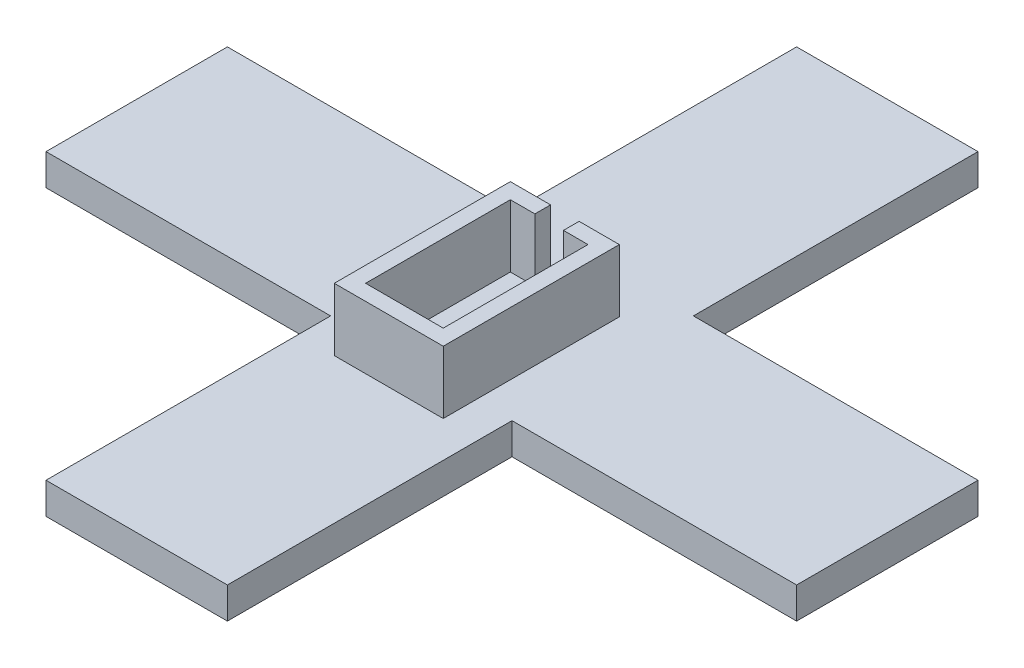
ISO-10303-21;
HEADER;
FILE_DESCRIPTION(('STEP AP214'),'2;1');
FILE_NAME('part.step','',(''),(''),'','','');
FILE_SCHEMA(('AUTOMOTIVE_DESIGN { 1 0 10303 214 1 1 1 1 }'));
ENDSEC;
DATA;
#1=APPLICATION_CONTEXT('core data for automotive mechanical design processes');
#2=APPLICATION_PROTOCOL_DEFINITION('international standard','automotive_design',2000,#1);
#3=PRODUCT_CONTEXT('',#1,'mechanical');
#4=PRODUCT('Part','Part','',(#3));
#5=PRODUCT_RELATED_PRODUCT_CATEGORY('part','',(#4));
#6=PRODUCT_DEFINITION_FORMATION('','',#4);
#7=PRODUCT_DEFINITION_CONTEXT('part definition',#1,'design');
#8=PRODUCT_DEFINITION('design','',#6,#7);
#9=PRODUCT_DEFINITION_SHAPE('','',#8);
#10=(LENGTH_UNIT() NAMED_UNIT(*) SI_UNIT(.MILLI.,.METRE.));
#11=(NAMED_UNIT(*) PLANE_ANGLE_UNIT() SI_UNIT($,.RADIAN.));
#12=(NAMED_UNIT(*) SI_UNIT($,.STERADIAN.) SOLID_ANGLE_UNIT());
#13=UNCERTAINTY_MEASURE_WITH_UNIT(LENGTH_MEASURE(1.E-05),#10,'distance_accuracy_value','');
#14=(GEOMETRIC_REPRESENTATION_CONTEXT(3) GLOBAL_UNCERTAINTY_ASSIGNED_CONTEXT((#13)) GLOBAL_UNIT_ASSIGNED_CONTEXT((#10,
#11,#12)) REPRESENTATION_CONTEXT('',''));
#15=CARTESIAN_POINT('',(0.,0.,0.));
#16=DIRECTION('',(0.,0.,1.));
#17=DIRECTION('',(1.,0.,0.));
#18=AXIS2_PLACEMENT_3D('',#15,#16,#17);
#19=CARTESIAN_POINT('',(0.,5.,0.));
#20=DIRECTION('',(0.,1.,0.));
#21=DIRECTION('',(0.,0.,1.));
#22=AXIS2_PLACEMENT_3D('',#19,#20,#21);
#23=PLANE('',#22);
#24=DIRECTION('',(-1.,0.,0.));
#25=VECTOR('',#24,1.);
#26=CARTESIAN_POINT('',(14.48,5.,-59.92));
#27=LINE('',#26,#25);
#28=CARTESIAN_POINT('',(14.48,5.,-59.92));
#29=VERTEX_POINT('',#28);
#30=CARTESIAN_POINT('',(-14.48,5.,-59.92));
#31=VERTEX_POINT('',#30);
#32=EDGE_CURVE('E115',#29,#31,#27,.T.);
#33=ORIENTED_EDGE('',*,*,#32,.T.);
#34=DIRECTION('',(0.,0.,1.));
#35=VECTOR('',#34,1.);
#36=CARTESIAN_POINT('',(-14.48,5.,-59.92));
#37=LINE('',#36,#35);
#38=CARTESIAN_POINT('',(-14.48,5.,-14.48));
#39=VERTEX_POINT('',#38);
#40=EDGE_CURVE('E298',#31,#39,#37,.T.);
#41=ORIENTED_EDGE('',*,*,#40,.T.);
#42=DIRECTION('',(-1.,0.,0.));
#43=VECTOR('',#42,1.);
#44=CARTESIAN_POINT('',(-14.48,5.,-14.48));
#45=LINE('',#44,#43);
#46=CARTESIAN_POINT('',(-59.92,5.,-14.48));
#47=VERTEX_POINT('',#46);
#48=EDGE_CURVE('E252',#39,#47,#45,.T.);
#49=ORIENTED_EDGE('',*,*,#48,.T.);
#50=DIRECTION('',(0.,0.,1.));
#51=VECTOR('',#50,1.);
#52=CARTESIAN_POINT('',(-59.92,5.,0.));
#53=LINE('',#52,#51);
#54=CARTESIAN_POINT('',(-59.92,5.,14.48));
#55=VERTEX_POINT('',#54);
#56=EDGE_CURVE('E270',#47,#55,#53,.T.);
#57=ORIENTED_EDGE('',*,*,#56,.T.);
#58=DIRECTION('',(1.,0.,0.));
#59=VECTOR('',#58,1.);
#60=CARTESIAN_POINT('',(-59.92,5.,14.48));
#61=LINE('',#60,#59);
#62=CARTESIAN_POINT('',(-14.48,5.,14.48));
#63=VERTEX_POINT('',#62);
#64=EDGE_CURVE('E266',#55,#63,#61,.T.);
#65=ORIENTED_EDGE('',*,*,#64,.T.);
#66=DIRECTION('',(0.,0.,1.));
#67=VECTOR('',#66,1.);
#68=CARTESIAN_POINT('',(-14.48,5.,14.48));
#69=LINE('',#68,#67);
#70=CARTESIAN_POINT('',(-14.48,5.,59.92));
#71=VERTEX_POINT('',#70);
#72=EDGE_CURVE('E269',#63,#71,#69,.T.);
#73=ORIENTED_EDGE('',*,*,#72,.T.);
#74=DIRECTION('',(1.,0.,0.));
#75=VECTOR('',#74,1.);
#76=CARTESIAN_POINT('',(-14.48,5.,59.92));
#77=LINE('',#76,#75);
#78=CARTESIAN_POINT('',(14.48,5.,59.92));
#79=VERTEX_POINT('',#78);
#80=EDGE_CURVE('E274',#71,#79,#77,.T.);
#81=ORIENTED_EDGE('',*,*,#80,.T.);
#82=DIRECTION('',(0.,0.,-1.));
#83=VECTOR('',#82,1.);
#84=CARTESIAN_POINT('',(14.48,5.,59.92));
#85=LINE('',#84,#83);
#86=CARTESIAN_POINT('',(14.48,5.,14.48));
#87=VERTEX_POINT('',#86);
#88=EDGE_CURVE('E281',#79,#87,#85,.T.);
#89=ORIENTED_EDGE('',*,*,#88,.T.);
#90=DIRECTION('',(1.,0.,0.));
#91=VECTOR('',#90,1.);
#92=CARTESIAN_POINT('',(14.48,5.,14.48));
#93=LINE('',#92,#91);
#94=CARTESIAN_POINT('',(59.92,5.,14.48));
#95=VERTEX_POINT('',#94);
#96=EDGE_CURVE('E151',#87,#95,#93,.T.);
#97=ORIENTED_EDGE('',*,*,#96,.T.);
#98=DIRECTION('',(0.,0.,-1.));
#99=VECTOR('',#98,1.);
#100=CARTESIAN_POINT('',(59.92,5.,0.));
#101=LINE('',#100,#99);
#102=CARTESIAN_POINT('',(59.92,5.,-14.48));
#103=VERTEX_POINT('',#102);
#104=EDGE_CURVE('E144',#95,#103,#101,.T.);
#105=ORIENTED_EDGE('',*,*,#104,.T.);
#106=DIRECTION('',(-1.,0.,0.));
#107=VECTOR('',#106,1.);
#108=CARTESIAN_POINT('',(59.92,5.,-14.48));
#109=LINE('',#108,#107);
#110=CARTESIAN_POINT('',(14.48,5.,-14.48));
#111=VERTEX_POINT('',#110);
#112=EDGE_CURVE('E148',#103,#111,#109,.T.);
#113=ORIENTED_EDGE('',*,*,#112,.T.);
#114=DIRECTION('',(0.,0.,-1.));
#115=VECTOR('',#114,1.);
#116=CARTESIAN_POINT('',(14.48,5.,-14.48));
#117=LINE('',#116,#115);
#118=EDGE_CURVE('E64',#111,#29,#117,.T.);
#119=ORIENTED_EDGE('',*,*,#118,.T.);
#120=EDGE_LOOP('',(#33,#41,#49,#57,#65,#73,#81,#89,#97,#105,#113,#119));
#121=FACE_BOUND('',#120,.T.);
#122=DIRECTION('',(-1.,0.,0.));
#123=VECTOR('',#122,1.);
#124=CARTESIAN_POINT('',(2.28,5.,-8.43499999999998));
#125=LINE('',#124,#123);
#126=CARTESIAN_POINT('',(8.7,5.,-8.43499999999998));
#127=VERTEX_POINT('',#126);
#128=CARTESIAN_POINT('',(2.28,5.,-8.43499999999998));
#129=VERTEX_POINT('',#128);
#130=EDGE_CURVE('E670',#127,#129,#125,.T.);
#131=ORIENTED_EDGE('',*,*,#130,.F.);
#132=DIRECTION('',(0.,0.,-1.));
#133=VECTOR('',#132,1.);
#134=CARTESIAN_POINT('',(8.7,5.,-8.43499999999998));
#135=LINE('',#134,#133);
#136=CARTESIAN_POINT('',(8.70000000000001,5.,19.675));
#137=VERTEX_POINT('',#136);
#138=EDGE_CURVE('E585',#137,#127,#135,.T.);
#139=ORIENTED_EDGE('',*,*,#138,.F.);
#140=DIRECTION('',(1.,0.,0.));
#141=VECTOR('',#140,1.);
#142=CARTESIAN_POINT('',(-8.7,5.,19.675));
#143=LINE('',#142,#141);
#144=CARTESIAN_POINT('',(-8.7,5.,19.675));
#145=VERTEX_POINT('',#144);
#146=EDGE_CURVE('E579',#145,#137,#143,.T.);
#147=ORIENTED_EDGE('',*,*,#146,.F.);
#148=DIRECTION('',(0.,0.,1.));
#149=VECTOR('',#148,1.);
#150=CARTESIAN_POINT('',(-8.7,5.,-8.43499999999998));
#151=LINE('',#150,#149);
#152=CARTESIAN_POINT('',(-8.7,5.,-8.43499999999998));
#153=VERTEX_POINT('',#152);
#154=EDGE_CURVE('E636',#153,#145,#151,.T.);
#155=ORIENTED_EDGE('',*,*,#154,.F.);
#156=DIRECTION('',(-1.,0.,0.));
#157=VECTOR('',#156,1.);
#158=CARTESIAN_POINT('',(-8.7,5.,-8.43499999999998));
#159=LINE('',#158,#157);
#160=CARTESIAN_POINT('',(-2.28,5.,-8.43499999999998));
#161=VERTEX_POINT('',#160);
#162=EDGE_CURVE('E639',#161,#153,#159,.T.);
#163=ORIENTED_EDGE('',*,*,#162,.F.);
#164=DIRECTION('',(0.,0.,-1.));
#165=VECTOR('',#164,1.);
#166=CARTESIAN_POINT('',(-2.28,5.,-8.43499999999998));
#167=LINE('',#166,#165);
#168=CARTESIAN_POINT('',(-2.28,5.,-5.93499999999998));
#169=VERTEX_POINT('',#168);
#170=EDGE_CURVE('E643',#169,#161,#167,.T.);
#171=ORIENTED_EDGE('',*,*,#170,.F.);
#172=DIRECTION('',(1.,0.,0.));
#173=VECTOR('',#172,1.);
#174=CARTESIAN_POINT('',(-2.28,5.,-5.93499999999998));
#175=LINE('',#174,#173);
#176=CARTESIAN_POINT('',(-6.2,5.,-5.93499999999998));
#177=VERTEX_POINT('',#176);
#178=EDGE_CURVE('E647',#177,#169,#175,.T.);
#179=ORIENTED_EDGE('',*,*,#178,.F.);
#180=DIRECTION('',(0.,0.,-1.));
#181=VECTOR('',#180,1.);
#182=CARTESIAN_POINT('',(-6.2,5.,-5.93499999999998));
#183=LINE('',#182,#181);
#184=CARTESIAN_POINT('',(-6.2,5.,17.175));
#185=VERTEX_POINT('',#184);
#186=EDGE_CURVE('E651',#185,#177,#183,.T.);
#187=ORIENTED_EDGE('',*,*,#186,.F.);
#188=DIRECTION('',(-1.,0.,0.));
#189=VECTOR('',#188,1.);
#190=CARTESIAN_POINT('',(-6.2,5.,17.175));
#191=LINE('',#190,#189);
#192=CARTESIAN_POINT('',(6.2,5.,17.175));
#193=VERTEX_POINT('',#192);
#194=EDGE_CURVE('E655',#193,#185,#191,.T.);
#195=ORIENTED_EDGE('',*,*,#194,.F.);
#196=DIRECTION('',(0.,0.,1.));
#197=VECTOR('',#196,1.);
#198=CARTESIAN_POINT('',(6.2,5.,17.175));
#199=LINE('',#198,#197);
#200=CARTESIAN_POINT('',(6.2,5.,-5.93499999999999));
#201=VERTEX_POINT('',#200);
#202=EDGE_CURVE('E659',#201,#193,#199,.T.);
#203=ORIENTED_EDGE('',*,*,#202,.F.);
#204=DIRECTION('',(1.,0.,0.));
#205=VECTOR('',#204,1.);
#206=CARTESIAN_POINT('',(6.2,5.,-5.93499999999999));
#207=LINE('',#206,#205);
#208=CARTESIAN_POINT('',(2.28,5.,-5.93499999999999));
#209=VERTEX_POINT('',#208);
#210=EDGE_CURVE('E663',#209,#201,#207,.T.);
#211=ORIENTED_EDGE('',*,*,#210,.F.);
#212=DIRECTION('',(0.,0.,1.));
#213=VECTOR('',#212,1.);
#214=CARTESIAN_POINT('',(2.28,5.,-5.93499999999999));
#215=LINE('',#214,#213);
#216=EDGE_CURVE('E667',#129,#209,#215,.T.);
#217=ORIENTED_EDGE('',*,*,#216,.F.);
#218=EDGE_LOOP('',(#131,#139,#147,#155,#163,#171,#179,#187,#195,#203,#211,#217));
#219=FACE_BOUND('',#218,.T.);
#220=ADVANCED_FACE('F39',(#121,#219),#23,.T.);
#221=CARTESIAN_POINT('',(0.,5.,-59.92));
#222=DIRECTION('',(0.,0.,1.));
#223=DIRECTION('',(1.,0.,0.));
#224=AXIS2_PLACEMENT_3D('',#221,#222,#223);
#225=PLANE('',#224);
#226=DIRECTION('',(-1.,0.,0.));
#227=VECTOR('',#226,1.);
#228=CARTESIAN_POINT('',(0.,0.,-59.92));
#229=LINE('',#228,#227);
#230=CARTESIAN_POINT('',(14.48,0.,-59.92));
#231=VERTEX_POINT('',#230);
#232=CARTESIAN_POINT('',(-14.48,0.,-59.92));
#233=VERTEX_POINT('',#232);
#234=EDGE_CURVE('E109',#231,#233,#229,.T.);
#235=ORIENTED_EDGE('',*,*,#234,.T.);
#236=DIRECTION('',(0.,-1.,0.));
#237=VECTOR('',#236,1.);
#238=CARTESIAN_POINT('',(-14.48,5.,-59.92));
#239=LINE('',#238,#237);
#240=EDGE_CURVE('E11',#31,#233,#239,.T.);
#241=ORIENTED_EDGE('',*,*,#240,.F.);
#242=ORIENTED_EDGE('',*,*,#32,.F.);
#243=DIRECTION('',(0.,-1.,0.));
#244=VECTOR('',#243,1.);
#245=CARTESIAN_POINT('',(14.48,5.,-59.92));
#246=LINE('',#245,#244);
#247=EDGE_CURVE('E172',#29,#231,#246,.T.);
#248=ORIENTED_EDGE('',*,*,#247,.T.);
#249=EDGE_LOOP('',(#235,#241,#242,#248));
#250=FACE_BOUND('',#249,.T.);
#251=ADVANCED_FACE('F41',(#250),#225,.F.);
#252=CARTESIAN_POINT('',(-14.48,5.,-59.92));
#253=DIRECTION('',(1.,0.,0.));
#254=DIRECTION('',(0.,0.,-1.));
#255=AXIS2_PLACEMENT_3D('',#252,#253,#254);
#256=PLANE('',#255);
#257=DIRECTION('',(0.,0.,1.));
#258=VECTOR('',#257,1.);
#259=CARTESIAN_POINT('',(-14.48,0.,-59.92));
#260=LINE('',#259,#258);
#261=CARTESIAN_POINT('',(-14.48,0.,-14.48));
#262=VERTEX_POINT('',#261);
#263=EDGE_CURVE('E178',#233,#262,#260,.T.);
#264=ORIENTED_EDGE('',*,*,#263,.T.);
#265=DIRECTION('',(0.,-1.,0.));
#266=VECTOR('',#265,1.);
#267=CARTESIAN_POINT('',(-14.48,5.,-14.48));
#268=LINE('',#267,#266);
#269=EDGE_CURVE('E48',#39,#262,#268,.T.);
#270=ORIENTED_EDGE('',*,*,#269,.F.);
#271=ORIENTED_EDGE('',*,*,#40,.F.);
#272=ORIENTED_EDGE('',*,*,#240,.T.);
#273=EDGE_LOOP('',(#264,#270,#271,#272));
#274=FACE_BOUND('',#273,.T.);
#275=ADVANCED_FACE('F305',(#274),#256,.F.);
#276=CARTESIAN_POINT('',(-14.48,5.,-14.48));
#277=DIRECTION('',(0.,0.,1.));
#278=DIRECTION('',(1.,0.,0.));
#279=AXIS2_PLACEMENT_3D('',#276,#277,#278);
#280=PLANE('',#279);
#281=DIRECTION('',(-1.,0.,0.));
#282=VECTOR('',#281,1.);
#283=CARTESIAN_POINT('',(-14.48,0.,-14.48));
#284=LINE('',#283,#282);
#285=CARTESIAN_POINT('',(-59.92,0.,-14.48));
#286=VERTEX_POINT('',#285);
#287=EDGE_CURVE('E182',#262,#286,#284,.T.);
#288=ORIENTED_EDGE('',*,*,#287,.T.);
#289=DIRECTION('',(0.,-1.,0.));
#290=VECTOR('',#289,1.);
#291=CARTESIAN_POINT('',(-59.92,5.,-14.48));
#292=LINE('',#291,#290);
#293=EDGE_CURVE('E241',#47,#286,#292,.T.);
#294=ORIENTED_EDGE('',*,*,#293,.F.);
#295=ORIENTED_EDGE('',*,*,#48,.F.);
#296=ORIENTED_EDGE('',*,*,#269,.T.);
#297=EDGE_LOOP('',(#288,#294,#295,#296));
#298=FACE_BOUND('',#297,.T.);
#299=ADVANCED_FACE('F250',(#298),#280,.F.);
#300=CARTESIAN_POINT('',(-59.92,5.,14.48));
#301=DIRECTION('',(1.,0.,0.));
#302=DIRECTION('',(0.,0.,-1.));
#303=AXIS2_PLACEMENT_3D('',#300,#301,#302);
#304=PLANE('',#303);
#305=DIRECTION('',(0.,0.,1.));
#306=VECTOR('',#305,1.);
#307=CARTESIAN_POINT('',(-59.92,0.,14.48));
#308=LINE('',#307,#306);
#309=CARTESIAN_POINT('',(-59.92,0.,14.48));
#310=VERTEX_POINT('',#309);
#311=EDGE_CURVE('E186',#286,#310,#308,.T.);
#312=ORIENTED_EDGE('',*,*,#311,.T.);
#313=DIRECTION('',(0.,-1.,0.));
#314=VECTOR('',#313,1.);
#315=CARTESIAN_POINT('',(-59.92,5.,14.48));
#316=LINE('',#315,#314);
#317=EDGE_CURVE('E237',#55,#310,#316,.T.);
#318=ORIENTED_EDGE('',*,*,#317,.F.);
#319=ORIENTED_EDGE('',*,*,#56,.F.);
#320=ORIENTED_EDGE('',*,*,#293,.T.);
#321=EDGE_LOOP('',(#312,#318,#319,#320));
#322=FACE_BOUND('',#321,.T.);
#323=ADVANCED_FACE('F260',(#322),#304,.F.);
#324=CARTESIAN_POINT('',(-59.92,5.,14.48));
#325=DIRECTION('',(0.,0.,-1.));
#326=DIRECTION('',(-1.,0.,0.));
#327=AXIS2_PLACEMENT_3D('',#324,#325,#326);
#328=PLANE('',#327);
#329=DIRECTION('',(1.,0.,0.));
#330=VECTOR('',#329,1.);
#331=CARTESIAN_POINT('',(-59.92,0.,14.48));
#332=LINE('',#331,#330);
#333=CARTESIAN_POINT('',(-14.48,0.,14.48));
#334=VERTEX_POINT('',#333);
#335=EDGE_CURVE('E189',#310,#334,#332,.T.);
#336=ORIENTED_EDGE('',*,*,#335,.T.);
#337=DIRECTION('',(0.,-1.,0.));
#338=VECTOR('',#337,1.);
#339=CARTESIAN_POINT('',(-14.48,5.,14.48));
#340=LINE('',#339,#338);
#341=EDGE_CURVE('E233',#63,#334,#340,.T.);
#342=ORIENTED_EDGE('',*,*,#341,.F.);
#343=ORIENTED_EDGE('',*,*,#64,.F.);
#344=ORIENTED_EDGE('',*,*,#317,.T.);
#345=EDGE_LOOP('',(#336,#342,#343,#344));
#346=FACE_BOUND('',#345,.T.);
#347=ADVANCED_FACE('F264',(#346),#328,.F.);
#348=CARTESIAN_POINT('',(-14.48,5.,14.48));
#349=DIRECTION('',(1.,0.,0.));
#350=DIRECTION('',(0.,0.,-1.));
#351=AXIS2_PLACEMENT_3D('',#348,#349,#350);
#352=PLANE('',#351);
#353=DIRECTION('',(0.,0.,1.));
#354=VECTOR('',#353,1.);
#355=CARTESIAN_POINT('',(-14.48,0.,14.48));
#356=LINE('',#355,#354);
#357=CARTESIAN_POINT('',(-14.48,0.,59.92));
#358=VERTEX_POINT('',#357);
#359=EDGE_CURVE('E192',#334,#358,#356,.T.);
#360=ORIENTED_EDGE('',*,*,#359,.T.);
#361=DIRECTION('',(0.,-1.,0.));
#362=VECTOR('',#361,1.);
#363=CARTESIAN_POINT('',(-14.48,5.,59.92));
#364=LINE('',#363,#362);
#365=EDGE_CURVE('E229',#71,#358,#364,.T.);
#366=ORIENTED_EDGE('',*,*,#365,.F.);
#367=ORIENTED_EDGE('',*,*,#72,.F.);
#368=ORIENTED_EDGE('',*,*,#341,.T.);
#369=EDGE_LOOP('',(#360,#366,#367,#368));
#370=FACE_BOUND('',#369,.T.);
#371=ADVANCED_FACE('F335',(#370),#352,.F.);
#372=CARTESIAN_POINT('',(0.,5.,59.92));
#373=DIRECTION('',(0.,0.,-1.));
#374=DIRECTION('',(-1.,0.,0.));
#375=AXIS2_PLACEMENT_3D('',#372,#373,#374);
#376=PLANE('',#375);
#377=DIRECTION('',(1.,0.,0.));
#378=VECTOR('',#377,1.);
#379=CARTESIAN_POINT('',(0.,0.,59.92));
#380=LINE('',#379,#378);
#381=CARTESIAN_POINT('',(14.48,0.,59.92));
#382=VERTEX_POINT('',#381);
#383=EDGE_CURVE('E196',#358,#382,#380,.T.);
#384=ORIENTED_EDGE('',*,*,#383,.T.);
#385=DIRECTION('',(0.,-1.,0.));
#386=VECTOR('',#385,1.);
#387=CARTESIAN_POINT('',(14.48,5.,59.92));
#388=LINE('',#387,#386);
#389=EDGE_CURVE('E225',#79,#382,#388,.T.);
#390=ORIENTED_EDGE('',*,*,#389,.F.);
#391=ORIENTED_EDGE('',*,*,#80,.F.);
#392=ORIENTED_EDGE('',*,*,#365,.T.);
#393=EDGE_LOOP('',(#384,#390,#391,#392));
#394=FACE_BOUND('',#393,.T.);
#395=ADVANCED_FACE('F332',(#394),#376,.F.);
#396=CARTESIAN_POINT('',(14.48,5.,59.92));
#397=DIRECTION('',(-1.,0.,0.));
#398=DIRECTION('',(0.,0.,1.));
#399=AXIS2_PLACEMENT_3D('',#396,#397,#398);
#400=PLANE('',#399);
#401=DIRECTION('',(0.,0.,-1.));
#402=VECTOR('',#401,1.);
#403=CARTESIAN_POINT('',(14.48,0.,59.92));
#404=LINE('',#403,#402);
#405=CARTESIAN_POINT('',(14.48,0.,14.48));
#406=VERTEX_POINT('',#405);
#407=EDGE_CURVE('E199',#382,#406,#404,.T.);
#408=ORIENTED_EDGE('',*,*,#407,.T.);
#409=DIRECTION('',(0.,-1.,0.));
#410=VECTOR('',#409,1.);
#411=CARTESIAN_POINT('',(14.48,5.,14.48));
#412=LINE('',#411,#410);
#413=EDGE_CURVE('E221',#87,#406,#412,.T.);
#414=ORIENTED_EDGE('',*,*,#413,.F.);
#415=ORIENTED_EDGE('',*,*,#88,.F.);
#416=ORIENTED_EDGE('',*,*,#389,.T.);
#417=EDGE_LOOP('',(#408,#414,#415,#416));
#418=FACE_BOUND('',#417,.T.);
#419=ADVANCED_FACE('F289',(#418),#400,.F.);
#420=CARTESIAN_POINT('',(14.48,5.,14.48));
#421=DIRECTION('',(0.,0.,-1.));
#422=DIRECTION('',(-1.,0.,0.));
#423=AXIS2_PLACEMENT_3D('',#420,#421,#422);
#424=PLANE('',#423);
#425=DIRECTION('',(1.,0.,0.));
#426=VECTOR('',#425,1.);
#427=CARTESIAN_POINT('',(14.48,0.,14.48));
#428=LINE('',#427,#426);
#429=CARTESIAN_POINT('',(59.92,0.,14.48));
#430=VERTEX_POINT('',#429);
#431=EDGE_CURVE('E202',#406,#430,#428,.T.);
#432=ORIENTED_EDGE('',*,*,#431,.T.);
#433=DIRECTION('',(0.,-1.,0.));
#434=VECTOR('',#433,1.);
#435=CARTESIAN_POINT('',(59.92,5.,14.48));
#436=LINE('',#435,#434);
#437=EDGE_CURVE('E164',#95,#430,#436,.T.);
#438=ORIENTED_EDGE('',*,*,#437,.F.);
#439=ORIENTED_EDGE('',*,*,#96,.F.);
#440=ORIENTED_EDGE('',*,*,#413,.T.);
#441=EDGE_LOOP('',(#432,#438,#439,#440));
#442=FACE_BOUND('',#441,.T.);
#443=ADVANCED_FACE('F293',(#442),#424,.F.);
#444=CARTESIAN_POINT('',(59.92,5.,0.));
#445=DIRECTION('',(-1.,0.,0.));
#446=DIRECTION('',(0.,0.,1.));
#447=AXIS2_PLACEMENT_3D('',#444,#445,#446);
#448=PLANE('',#447);
#449=DIRECTION('',(0.,0.,-1.));
#450=VECTOR('',#449,1.);
#451=CARTESIAN_POINT('',(59.92,0.,0.));
#452=LINE('',#451,#450);
#453=CARTESIAN_POINT('',(59.92,0.,-14.48));
#454=VERTEX_POINT('',#453);
#455=EDGE_CURVE('E160',#430,#454,#452,.T.);
#456=ORIENTED_EDGE('',*,*,#455,.T.);
#457=DIRECTION('',(0.,-1.,0.));
#458=VECTOR('',#457,1.);
#459=CARTESIAN_POINT('',(59.92,5.,-14.48));
#460=LINE('',#459,#458);
#461=EDGE_CURVE('E158',#103,#454,#460,.T.);
#462=ORIENTED_EDGE('',*,*,#461,.F.);
#463=ORIENTED_EDGE('',*,*,#104,.F.);
#464=ORIENTED_EDGE('',*,*,#437,.T.);
#465=EDGE_LOOP('',(#456,#462,#463,#464));
#466=FACE_BOUND('',#465,.T.);
#467=ADVANCED_FACE('F159',(#466),#448,.F.);
#468=CARTESIAN_POINT('',(59.92,5.,-14.48));
#469=DIRECTION('',(0.,0.,1.));
#470=DIRECTION('',(1.,0.,0.));
#471=AXIS2_PLACEMENT_3D('',#468,#469,#470);
#472=PLANE('',#471);
#473=DIRECTION('',(-1.,0.,0.));
#474=VECTOR('',#473,1.);
#475=CARTESIAN_POINT('',(59.92,0.,-14.48));
#476=LINE('',#475,#474);
#477=CARTESIAN_POINT('',(14.48,0.,-14.48));
#478=VERTEX_POINT('',#477);
#479=EDGE_CURVE('E208',#454,#478,#476,.T.);
#480=ORIENTED_EDGE('',*,*,#479,.T.);
#481=DIRECTION('',(0.,-1.,0.));
#482=VECTOR('',#481,1.);
#483=CARTESIAN_POINT('',(14.48,5.,-14.48));
#484=LINE('',#483,#482);
#485=EDGE_CURVE('E165',#111,#478,#484,.T.);
#486=ORIENTED_EDGE('',*,*,#485,.F.);
#487=ORIENTED_EDGE('',*,*,#112,.F.);
#488=ORIENTED_EDGE('',*,*,#461,.T.);
#489=EDGE_LOOP('',(#480,#486,#487,#488));
#490=FACE_BOUND('',#489,.T.);
#491=ADVANCED_FACE('F167',(#490),#472,.F.);
#492=CARTESIAN_POINT('',(14.48,5.,-14.48));
#493=DIRECTION('',(-1.,0.,0.));
#494=DIRECTION('',(0.,0.,1.));
#495=AXIS2_PLACEMENT_3D('',#492,#493,#494);
#496=PLANE('',#495);
#497=DIRECTION('',(0.,0.,-1.));
#498=VECTOR('',#497,1.);
#499=CARTESIAN_POINT('',(14.48,0.,-14.48));
#500=LINE('',#499,#498);
#501=EDGE_CURVE('E211',#478,#231,#500,.T.);
#502=ORIENTED_EDGE('',*,*,#501,.T.);
#503=ORIENTED_EDGE('',*,*,#247,.F.);
#504=ORIENTED_EDGE('',*,*,#118,.F.);
#505=ORIENTED_EDGE('',*,*,#485,.T.);
#506=EDGE_LOOP('',(#502,#503,#504,#505));
#507=FACE_BOUND('',#506,.T.);
#508=ADVANCED_FACE('F295',(#507),#496,.F.);
#509=CARTESIAN_POINT('',(0.,0.,0.));
#510=DIRECTION('',(0.,1.,0.));
#511=DIRECTION('',(0.,0.,1.));
#512=AXIS2_PLACEMENT_3D('',#509,#510,#511);
#513=PLANE('',#512);
#514=ORIENTED_EDGE('',*,*,#234,.F.);
#515=ORIENTED_EDGE('',*,*,#501,.F.);
#516=ORIENTED_EDGE('',*,*,#479,.F.);
#517=ORIENTED_EDGE('',*,*,#455,.F.);
#518=ORIENTED_EDGE('',*,*,#431,.F.);
#519=ORIENTED_EDGE('',*,*,#407,.F.);
#520=ORIENTED_EDGE('',*,*,#383,.F.);
#521=ORIENTED_EDGE('',*,*,#359,.F.);
#522=ORIENTED_EDGE('',*,*,#335,.F.);
#523=ORIENTED_EDGE('',*,*,#311,.F.);
#524=ORIENTED_EDGE('',*,*,#287,.F.);
#525=ORIENTED_EDGE('',*,*,#263,.F.);
#526=EDGE_LOOP('',(#514,#515,#516,#517,#518,#519,#520,#521,#522,#523,#524,#525));
#527=FACE_BOUND('',#526,.T.);
#528=ADVANCED_FACE('F255',(#527),#513,.F.);
#529=CARTESIAN_POINT('',(8.7,15.,-8.43499999999998));
#530=DIRECTION('',(-1.,0.,0.));
#531=DIRECTION('',(0.,0.,1.));
#532=AXIS2_PLACEMENT_3D('',#529,#530,#531);
#533=PLANE('',#532);
#534=ORIENTED_EDGE('',*,*,#138,.T.);
#535=DIRECTION('',(0.,-1.,0.));
#536=VECTOR('',#535,1.);
#537=CARTESIAN_POINT('',(8.7,15.,-8.43499999999998));
#538=LINE('',#537,#536);
#539=CARTESIAN_POINT('',(8.7,15.,-8.43499999999998));
#540=VERTEX_POINT('',#539);
#541=EDGE_CURVE('E179',#540,#127,#538,.T.);
#542=ORIENTED_EDGE('',*,*,#541,.F.);
#543=DIRECTION('',(0.,0.,-1.));
#544=VECTOR('',#543,1.);
#545=CARTESIAN_POINT('',(8.7,15.,-8.43499999999998));
#546=LINE('',#545,#544);
#547=CARTESIAN_POINT('',(8.70000000000001,15.,19.675));
#548=VERTEX_POINT('',#547);
#549=EDGE_CURVE('E566',#548,#540,#546,.T.);
#550=ORIENTED_EDGE('',*,*,#549,.F.);
#551=DIRECTION('',(0.,-1.,0.));
#552=VECTOR('',#551,1.);
#553=CARTESIAN_POINT('',(8.70000000000001,15.,19.675));
#554=LINE('',#553,#552);
#555=EDGE_CURVE('E631',#548,#137,#554,.T.);
#556=ORIENTED_EDGE('',*,*,#555,.T.);
#557=EDGE_LOOP('',(#534,#542,#550,#556));
#558=FACE_BOUND('',#557,.T.);
#559=ADVANCED_FACE('F318',(#558),#533,.F.);
#560=CARTESIAN_POINT('',(2.28,15.,-8.43499999999998));
#561=DIRECTION('',(0.,0.,1.));
#562=DIRECTION('',(1.,0.,0.));
#563=AXIS2_PLACEMENT_3D('',#560,#561,#562);
#564=PLANE('',#563);
#565=ORIENTED_EDGE('',*,*,#130,.T.);
#566=DIRECTION('',(0.,-1.,0.));
#567=VECTOR('',#566,1.);
#568=CARTESIAN_POINT('',(2.28,15.,-8.43499999999998));
#569=LINE('',#568,#567);
#570=CARTESIAN_POINT('',(2.28,15.,-8.43499999999998));
#571=VERTEX_POINT('',#570);
#572=EDGE_CURVE('E589',#571,#129,#569,.T.);
#573=ORIENTED_EDGE('',*,*,#572,.F.);
#574=DIRECTION('',(-1.,0.,0.));
#575=VECTOR('',#574,1.);
#576=CARTESIAN_POINT('',(2.28,15.,-8.43499999999998));
#577=LINE('',#576,#575);
#578=EDGE_CURVE('E571',#540,#571,#577,.T.);
#579=ORIENTED_EDGE('',*,*,#578,.F.);
#580=ORIENTED_EDGE('',*,*,#541,.T.);
#581=EDGE_LOOP('',(#565,#573,#579,#580));
#582=FACE_BOUND('',#581,.T.);
#583=ADVANCED_FACE('F389',(#582),#564,.F.);
#584=CARTESIAN_POINT('',(2.28,15.,-5.93499999999999));
#585=DIRECTION('',(1.,0.,0.));
#586=DIRECTION('',(0.,0.,-1.));
#587=AXIS2_PLACEMENT_3D('',#584,#585,#586);
#588=PLANE('',#587);
#589=ORIENTED_EDGE('',*,*,#216,.T.);
#590=DIRECTION('',(0.,-1.,0.));
#591=VECTOR('',#590,1.);
#592=CARTESIAN_POINT('',(2.28,15.,-5.93499999999999));
#593=LINE('',#592,#591);
#594=CARTESIAN_POINT('',(2.28,15.,-5.93499999999999));
#595=VERTEX_POINT('',#594);
#596=EDGE_CURVE('E592',#595,#209,#593,.T.);
#597=ORIENTED_EDGE('',*,*,#596,.F.);
#598=DIRECTION('',(0.,0.,1.));
#599=VECTOR('',#598,1.);
#600=CARTESIAN_POINT('',(2.28,15.,-5.93499999999999));
#601=LINE('',#600,#599);
#602=EDGE_CURVE('E708',#571,#595,#601,.T.);
#603=ORIENTED_EDGE('',*,*,#602,.F.);
#604=ORIENTED_EDGE('',*,*,#572,.T.);
#605=EDGE_LOOP('',(#589,#597,#603,#604));
#606=FACE_BOUND('',#605,.T.);
#607=ADVANCED_FACE('F396',(#606),#588,.F.);
#608=CARTESIAN_POINT('',(6.2,15.,-5.93499999999999));
#609=DIRECTION('',(0.,0.,-1.));
#610=DIRECTION('',(-1.,0.,0.));
#611=AXIS2_PLACEMENT_3D('',#608,#609,#610);
#612=PLANE('',#611);
#613=ORIENTED_EDGE('',*,*,#210,.T.);
#614=DIRECTION('',(0.,-1.,0.));
#615=VECTOR('',#614,1.);
#616=CARTESIAN_POINT('',(6.2,15.,-5.93499999999999));
#617=LINE('',#616,#615);
#618=CARTESIAN_POINT('',(6.2,15.,-5.93499999999999));
#619=VERTEX_POINT('',#618);
#620=EDGE_CURVE('E599',#619,#201,#617,.T.);
#621=ORIENTED_EDGE('',*,*,#620,.F.);
#622=DIRECTION('',(1.,0.,0.));
#623=VECTOR('',#622,1.);
#624=CARTESIAN_POINT('',(6.2,15.,-5.93499999999999));
#625=LINE('',#624,#623);
#626=EDGE_CURVE('E704',#595,#619,#625,.T.);
#627=ORIENTED_EDGE('',*,*,#626,.F.);
#628=ORIENTED_EDGE('',*,*,#596,.T.);
#629=EDGE_LOOP('',(#613,#621,#627,#628));
#630=FACE_BOUND('',#629,.T.);
#631=ADVANCED_FACE('F403',(#630),#612,.F.);
#632=CARTESIAN_POINT('',(6.2,15.,17.175));
#633=DIRECTION('',(1.,0.,0.));
#634=DIRECTION('',(0.,0.,-1.));
#635=AXIS2_PLACEMENT_3D('',#632,#633,#634);
#636=PLANE('',#635);
#637=ORIENTED_EDGE('',*,*,#202,.T.);
#638=DIRECTION('',(0.,-1.,0.));
#639=VECTOR('',#638,1.);
#640=CARTESIAN_POINT('',(6.2,15.,17.175));
#641=LINE('',#640,#639);
#642=CARTESIAN_POINT('',(6.2,15.,17.175));
#643=VERTEX_POINT('',#642);
#644=EDGE_CURVE('E605',#643,#193,#641,.T.);
#645=ORIENTED_EDGE('',*,*,#644,.F.);
#646=DIRECTION('',(0.,0.,1.));
#647=VECTOR('',#646,1.);
#648=CARTESIAN_POINT('',(6.2,15.,17.175));
#649=LINE('',#648,#647);
#650=EDGE_CURVE('E700',#619,#643,#649,.T.);
#651=ORIENTED_EDGE('',*,*,#650,.F.);
#652=ORIENTED_EDGE('',*,*,#620,.T.);
#653=EDGE_LOOP('',(#637,#645,#651,#652));
#654=FACE_BOUND('',#653,.T.);
#655=ADVANCED_FACE('F411',(#654),#636,.F.);
#656=CARTESIAN_POINT('',(-6.2,15.,17.175));
#657=DIRECTION('',(0.,0.,1.));
#658=DIRECTION('',(1.,0.,0.));
#659=AXIS2_PLACEMENT_3D('',#656,#657,#658);
#660=PLANE('',#659);
#661=ORIENTED_EDGE('',*,*,#194,.T.);
#662=DIRECTION('',(0.,-1.,0.));
#663=VECTOR('',#662,1.);
#664=CARTESIAN_POINT('',(-6.2,15.,17.175));
#665=LINE('',#664,#663);
#666=CARTESIAN_POINT('',(-6.2,15.,17.175));
#667=VERTEX_POINT('',#666);
#668=EDGE_CURVE('E609',#667,#185,#665,.T.);
#669=ORIENTED_EDGE('',*,*,#668,.F.);
#670=DIRECTION('',(-1.,0.,0.));
#671=VECTOR('',#670,1.);
#672=CARTESIAN_POINT('',(-6.2,15.,17.175));
#673=LINE('',#672,#671);
#674=EDGE_CURVE('E696',#643,#667,#673,.T.);
#675=ORIENTED_EDGE('',*,*,#674,.F.);
#676=ORIENTED_EDGE('',*,*,#644,.T.);
#677=EDGE_LOOP('',(#661,#669,#675,#676));
#678=FACE_BOUND('',#677,.T.);
#679=ADVANCED_FACE('F419',(#678),#660,.F.);
#680=CARTESIAN_POINT('',(-6.2,15.,-5.93499999999998));
#681=DIRECTION('',(-1.,0.,0.));
#682=DIRECTION('',(0.,0.,1.));
#683=AXIS2_PLACEMENT_3D('',#680,#681,#682);
#684=PLANE('',#683);
#685=ORIENTED_EDGE('',*,*,#186,.T.);
#686=DIRECTION('',(0.,-1.,0.));
#687=VECTOR('',#686,1.);
#688=CARTESIAN_POINT('',(-6.2,15.,-5.93499999999998));
#689=LINE('',#688,#687);
#690=CARTESIAN_POINT('',(-6.2,15.,-5.93499999999998));
#691=VERTEX_POINT('',#690);
#692=EDGE_CURVE('E613',#691,#177,#689,.T.);
#693=ORIENTED_EDGE('',*,*,#692,.F.);
#694=DIRECTION('',(0.,0.,-1.));
#695=VECTOR('',#694,1.);
#696=CARTESIAN_POINT('',(-6.2,15.,-5.93499999999998));
#697=LINE('',#696,#695);
#698=EDGE_CURVE('E692',#667,#691,#697,.T.);
#699=ORIENTED_EDGE('',*,*,#698,.F.);
#700=ORIENTED_EDGE('',*,*,#668,.T.);
#701=EDGE_LOOP('',(#685,#693,#699,#700));
#702=FACE_BOUND('',#701,.T.);
#703=ADVANCED_FACE('F427',(#702),#684,.F.);
#704=CARTESIAN_POINT('',(-2.28,15.,-5.93499999999998));
#705=DIRECTION('',(0.,0.,-1.));
#706=DIRECTION('',(-1.,0.,0.));
#707=AXIS2_PLACEMENT_3D('',#704,#705,#706);
#708=PLANE('',#707);
#709=ORIENTED_EDGE('',*,*,#178,.T.);
#710=DIRECTION('',(0.,-1.,0.));
#711=VECTOR('',#710,1.);
#712=CARTESIAN_POINT('',(-2.28,15.,-5.93499999999998));
#713=LINE('',#712,#711);
#714=CARTESIAN_POINT('',(-2.28,15.,-5.93499999999998));
#715=VERTEX_POINT('',#714);
#716=EDGE_CURVE('E617',#715,#169,#713,.T.);
#717=ORIENTED_EDGE('',*,*,#716,.F.);
#718=DIRECTION('',(1.,0.,0.));
#719=VECTOR('',#718,1.);
#720=CARTESIAN_POINT('',(-2.28,15.,-5.93499999999998));
#721=LINE('',#720,#719);
#722=EDGE_CURVE('E688',#691,#715,#721,.T.);
#723=ORIENTED_EDGE('',*,*,#722,.F.);
#724=ORIENTED_EDGE('',*,*,#692,.T.);
#725=EDGE_LOOP('',(#709,#717,#723,#724));
#726=FACE_BOUND('',#725,.T.);
#727=ADVANCED_FACE('F435',(#726),#708,.F.);
#728=CARTESIAN_POINT('',(-2.28,15.,-8.43499999999998));
#729=DIRECTION('',(-1.,0.,0.));
#730=DIRECTION('',(0.,0.,1.));
#731=AXIS2_PLACEMENT_3D('',#728,#729,#730);
#732=PLANE('',#731);
#733=ORIENTED_EDGE('',*,*,#170,.T.);
#734=DIRECTION('',(0.,-1.,0.));
#735=VECTOR('',#734,1.);
#736=CARTESIAN_POINT('',(-2.28,15.,-8.43499999999998));
#737=LINE('',#736,#735);
#738=CARTESIAN_POINT('',(-2.28,15.,-8.43499999999998));
#739=VERTEX_POINT('',#738);
#740=EDGE_CURVE('E621',#739,#161,#737,.T.);
#741=ORIENTED_EDGE('',*,*,#740,.F.);
#742=DIRECTION('',(0.,0.,-1.));
#743=VECTOR('',#742,1.);
#744=CARTESIAN_POINT('',(-2.28,15.,-8.43499999999998));
#745=LINE('',#744,#743);
#746=EDGE_CURVE('E684',#715,#739,#745,.T.);
#747=ORIENTED_EDGE('',*,*,#746,.F.);
#748=ORIENTED_EDGE('',*,*,#716,.T.);
#749=EDGE_LOOP('',(#733,#741,#747,#748));
#750=FACE_BOUND('',#749,.T.);
#751=ADVANCED_FACE('F443',(#750),#732,.F.);
#752=CARTESIAN_POINT('',(-8.7,15.,-8.43499999999998));
#753=DIRECTION('',(0.,0.,1.));
#754=DIRECTION('',(1.,0.,0.));
#755=AXIS2_PLACEMENT_3D('',#752,#753,#754);
#756=PLANE('',#755);
#757=ORIENTED_EDGE('',*,*,#162,.T.);
#758=DIRECTION('',(0.,-1.,0.));
#759=VECTOR('',#758,1.);
#760=CARTESIAN_POINT('',(-8.7,15.,-8.43499999999998));
#761=LINE('',#760,#759);
#762=CARTESIAN_POINT('',(-8.7,15.,-8.43499999999998));
#763=VERTEX_POINT('',#762);
#764=EDGE_CURVE('E625',#763,#153,#761,.T.);
#765=ORIENTED_EDGE('',*,*,#764,.F.);
#766=DIRECTION('',(-1.,0.,0.));
#767=VECTOR('',#766,1.);
#768=CARTESIAN_POINT('',(-8.7,15.,-8.43499999999998));
#769=LINE('',#768,#767);
#770=EDGE_CURVE('E680',#739,#763,#769,.T.);
#771=ORIENTED_EDGE('',*,*,#770,.F.);
#772=ORIENTED_EDGE('',*,*,#740,.T.);
#773=EDGE_LOOP('',(#757,#765,#771,#772));
#774=FACE_BOUND('',#773,.T.);
#775=ADVANCED_FACE('F451',(#774),#756,.F.);
#776=CARTESIAN_POINT('',(-8.7,15.,-8.43499999999998));
#777=DIRECTION('',(1.,0.,0.));
#778=DIRECTION('',(0.,0.,-1.));
#779=AXIS2_PLACEMENT_3D('',#776,#777,#778);
#780=PLANE('',#779);
#781=ORIENTED_EDGE('',*,*,#154,.T.);
#782=DIRECTION('',(0.,-1.,0.));
#783=VECTOR('',#782,1.);
#784=CARTESIAN_POINT('',(-8.7,15.,19.675));
#785=LINE('',#784,#783);
#786=CARTESIAN_POINT('',(-8.7,15.,19.675));
#787=VERTEX_POINT('',#786);
#788=EDGE_CURVE('E55',#787,#145,#785,.T.);
#789=ORIENTED_EDGE('',*,*,#788,.F.);
#790=DIRECTION('',(0.,0.,1.));
#791=VECTOR('',#790,1.);
#792=CARTESIAN_POINT('',(-8.7,15.,-8.43499999999998));
#793=LINE('',#792,#791);
#794=EDGE_CURVE('E677',#763,#787,#793,.T.);
#795=ORIENTED_EDGE('',*,*,#794,.F.);
#796=ORIENTED_EDGE('',*,*,#764,.T.);
#797=EDGE_LOOP('',(#781,#789,#795,#796));
#798=FACE_BOUND('',#797,.T.);
#799=ADVANCED_FACE('F459',(#798),#780,.F.);
#800=CARTESIAN_POINT('',(-8.7,15.,19.675));
#801=DIRECTION('',(0.,0.,-1.));
#802=DIRECTION('',(-1.,0.,0.));
#803=AXIS2_PLACEMENT_3D('',#800,#801,#802);
#804=PLANE('',#803);
#805=ORIENTED_EDGE('',*,*,#146,.T.);
#806=ORIENTED_EDGE('',*,*,#555,.F.);
#807=DIRECTION('',(1.,0.,0.));
#808=VECTOR('',#807,1.);
#809=CARTESIAN_POINT('',(-8.7,15.,19.675));
#810=LINE('',#809,#808);
#811=EDGE_CURVE('E574',#787,#548,#810,.T.);
#812=ORIENTED_EDGE('',*,*,#811,.F.);
#813=ORIENTED_EDGE('',*,*,#788,.T.);
#814=EDGE_LOOP('',(#805,#806,#812,#813));
#815=FACE_BOUND('',#814,.T.);
#816=ADVANCED_FACE('F467',(#815),#804,.F.);
#817=CARTESIAN_POINT('',(0.,15.,0.));
#818=DIRECTION('',(0.,1.,0.));
#819=DIRECTION('',(0.,0.,1.));
#820=AXIS2_PLACEMENT_3D('',#817,#818,#819);
#821=PLANE('',#820);
#822=ORIENTED_EDGE('',*,*,#549,.T.);
#823=ORIENTED_EDGE('',*,*,#578,.T.);
#824=ORIENTED_EDGE('',*,*,#602,.T.);
#825=ORIENTED_EDGE('',*,*,#626,.T.);
#826=ORIENTED_EDGE('',*,*,#650,.T.);
#827=ORIENTED_EDGE('',*,*,#674,.T.);
#828=ORIENTED_EDGE('',*,*,#698,.T.);
#829=ORIENTED_EDGE('',*,*,#722,.T.);
#830=ORIENTED_EDGE('',*,*,#746,.T.);
#831=ORIENTED_EDGE('',*,*,#770,.T.);
#832=ORIENTED_EDGE('',*,*,#794,.T.);
#833=ORIENTED_EDGE('',*,*,#811,.T.);
#834=EDGE_LOOP('',(#822,#823,#824,#825,#826,#827,#828,#829,#830,#831,#832,#833));
#835=FACE_BOUND('',#834,.T.);
#836=ADVANCED_FACE('F475',(#835),#821,.T.);
#837=CLOSED_SHELL('',(#220,#251,#275,#299,#323,#347,#371,#395,#419,#443,#467,#491,#508,#528,
#559,#583,#607,#631,#655,#679,#703,#727,#751,#775,#799,#816,#836));
#838=MANIFOLD_SOLID_BREP('B2',#837);
#839=ADVANCED_BREP_SHAPE_REPRESENTATION('',(#18,#838),#14);
#840=SHAPE_DEFINITION_REPRESENTATION(#9,#839);
ENDSEC;
END-ISO-10303-21;
